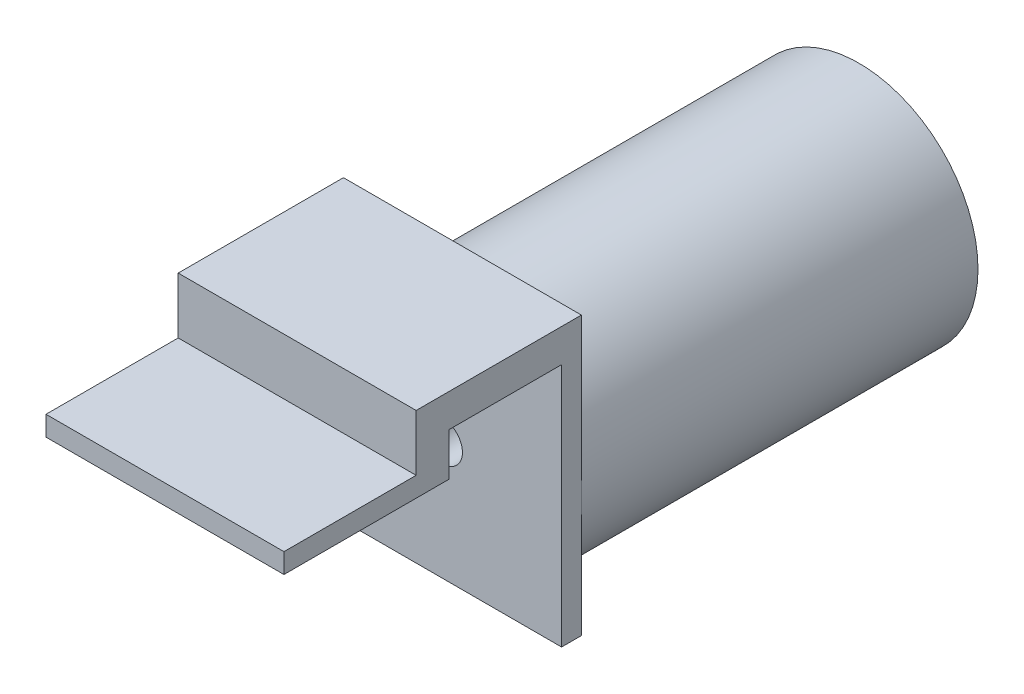
ISO-10303-21;
HEADER;
FILE_DESCRIPTION(('STEP AP214'),'2;1');
FILE_NAME('part.step','',(''),(''),'','','');
FILE_SCHEMA(('AUTOMOTIVE_DESIGN { 1 0 10303 214 1 1 1 1 }'));
ENDSEC;
DATA;
#1=APPLICATION_CONTEXT('core data for automotive mechanical design processes');
#2=APPLICATION_PROTOCOL_DEFINITION('international standard','automotive_design',2000,#1);
#3=PRODUCT_CONTEXT('',#1,'mechanical');
#4=PRODUCT('Part','Part','',(#3));
#5=PRODUCT_RELATED_PRODUCT_CATEGORY('part','',(#4));
#6=PRODUCT_DEFINITION_FORMATION('','',#4);
#7=PRODUCT_DEFINITION_CONTEXT('part definition',#1,'design');
#8=PRODUCT_DEFINITION('design','',#6,#7);
#9=PRODUCT_DEFINITION_SHAPE('','',#8);
#10=(LENGTH_UNIT() NAMED_UNIT(*) SI_UNIT(.MILLI.,.METRE.));
#11=(NAMED_UNIT(*) PLANE_ANGLE_UNIT() SI_UNIT($,.RADIAN.));
#12=(NAMED_UNIT(*) SI_UNIT($,.STERADIAN.) SOLID_ANGLE_UNIT());
#13=UNCERTAINTY_MEASURE_WITH_UNIT(LENGTH_MEASURE(1.E-05),#10,'distance_accuracy_value','');
#14=(GEOMETRIC_REPRESENTATION_CONTEXT(3) GLOBAL_UNCERTAINTY_ASSIGNED_CONTEXT((#13)) GLOBAL_UNIT_ASSIGNED_CONTEXT((#10,
#11,#12)) REPRESENTATION_CONTEXT('',''));
#15=CARTESIAN_POINT('',(0.,0.,0.));
#16=DIRECTION('',(0.,0.,1.));
#17=DIRECTION('',(1.,0.,0.));
#18=AXIS2_PLACEMENT_3D('',#15,#16,#17);
#19=CARTESIAN_POINT('',(0.,0.,85.));
#20=DIRECTION('',(0.,0.,-1.));
#21=DIRECTION('',(-1.,0.,0.));
#22=AXIS2_PLACEMENT_3D('',#19,#20,#21);
#23=PLANE('',#22);
#24=DIRECTION('',(-1.,0.,0.));
#25=VECTOR('',#24,1.);
#26=CARTESIAN_POINT('',(-18.,15.5,85.));
#27=LINE('',#26,#25);
#28=CARTESIAN_POINT('',(18.,15.5,85.));
#29=VERTEX_POINT('',#28);
#30=CARTESIAN_POINT('',(-18.,15.5,85.));
#31=VERTEX_POINT('',#30);
#32=EDGE_CURVE('E50',#29,#31,#27,.T.);
#33=ORIENTED_EDGE('',*,*,#32,.F.);
#34=DIRECTION('',(0.,1.,0.));
#35=VECTOR('',#34,1.);
#36=CARTESIAN_POINT('',(18.,19.,85.));
#37=LINE('',#36,#35);
#38=CARTESIAN_POINT('',(18.,24.,85.));
#39=VERTEX_POINT('',#38);
#40=EDGE_CURVE('E161',#29,#39,#37,.T.);
#41=ORIENTED_EDGE('',*,*,#40,.T.);
#42=DIRECTION('',(-1.,0.,0.));
#43=VECTOR('',#42,1.);
#44=CARTESIAN_POINT('',(-18.,24.,85.));
#45=LINE('',#44,#43);
#46=CARTESIAN_POINT('',(-18.,24.,85.));
#47=VERTEX_POINT('',#46);
#48=EDGE_CURVE('E133',#39,#47,#45,.T.);
#49=ORIENTED_EDGE('',*,*,#48,.T.);
#50=DIRECTION('',(0.,-1.,0.));
#51=VECTOR('',#50,1.);
#52=CARTESIAN_POINT('',(-18.,19.,85.));
#53=LINE('',#52,#51);
#54=EDGE_CURVE('E159',#47,#31,#53,.T.);
#55=ORIENTED_EDGE('',*,*,#54,.T.);
#56=EDGE_LOOP('',(#33,#41,#49,#55));
#57=FACE_BOUND('',#56,.T.);
#58=ADVANCED_FACE('F33',(#57),#23,.F.);
#59=CARTESIAN_POINT('',(0.,0.,63.));
#60=DIRECTION('',(0.,0.,1.));
#61=DIRECTION('',(1.,0.,0.));
#62=AXIS2_PLACEMENT_3D('',#59,#60,#61);
#63=PLANE('',#62);
#64=CARTESIAN_POINT('',(0.,0.,63.));
#65=DIRECTION('',(0.,0.,1.));
#66=DIRECTION('',(1.,0.,0.));
#67=AXIS2_PLACEMENT_3D('',#64,#65,#66);
#68=CIRCLE('',#67,3.);
#69=CARTESIAN_POINT('',(3.,0.,63.));
#70=VERTEX_POINT('',#69);
#71=EDGE_CURVE('E182',#70,#70,#68,.T.);
#72=ORIENTED_EDGE('',*,*,#71,.F.);
#73=EDGE_LOOP('',(#72));
#74=FACE_BOUND('',#73,.T.);
#75=DIRECTION('',(0.,1.,0.));
#76=VECTOR('',#75,1.);
#77=CARTESIAN_POINT('',(18.,24.,63.));
#78=LINE('',#77,#76);
#79=CARTESIAN_POINT('',(18.,-18.,63.));
#80=VERTEX_POINT('',#79);
#81=CARTESIAN_POINT('',(18.,19.,63.));
#82=VERTEX_POINT('',#81);
#83=EDGE_CURVE('E186',#80,#82,#78,.T.);
#84=ORIENTED_EDGE('',*,*,#83,.T.);
#85=DIRECTION('',(-1.,0.,0.));
#86=VECTOR('',#85,1.);
#87=CARTESIAN_POINT('',(18.,19.,63.));
#88=LINE('',#87,#86);
#89=CARTESIAN_POINT('',(-18.,19.,63.));
#90=VERTEX_POINT('',#89);
#91=EDGE_CURVE('E170',#82,#90,#88,.T.);
#92=ORIENTED_EDGE('',*,*,#91,.T.);
#93=DIRECTION('',(0.,-1.,0.));
#94=VECTOR('',#93,1.);
#95=CARTESIAN_POINT('',(-18.,24.,63.));
#96=LINE('',#95,#94);
#97=CARTESIAN_POINT('',(-18.,-18.,63.));
#98=VERTEX_POINT('',#97);
#99=EDGE_CURVE('E189',#90,#98,#96,.T.);
#100=ORIENTED_EDGE('',*,*,#99,.T.);
#101=DIRECTION('',(1.,0.,0.));
#102=VECTOR('',#101,1.);
#103=CARTESIAN_POINT('',(-18.,-18.,63.));
#104=LINE('',#103,#102);
#105=EDGE_CURVE('E192',#98,#80,#104,.T.);
#106=ORIENTED_EDGE('',*,*,#105,.T.);
#107=EDGE_LOOP('',(#84,#92,#100,#106));
#108=FACE_BOUND('',#107,.T.);
#109=ADVANCED_FACE('F249',(#74,#108),#63,.T.);
#110=CARTESIAN_POINT('',(0.,0.,60.));
#111=DIRECTION('',(0.,0.,-1.));
#112=DIRECTION('',(-1.,0.,0.));
#113=AXIS2_PLACEMENT_3D('',#110,#111,#112);
#114=CYLINDRICAL_SURFACE('',#113,18.);
#115=CARTESIAN_POINT('',(0.,0.,60.));
#116=DIRECTION('',(0.,0.,1.));
#117=DIRECTION('',(1.,0.,0.));
#118=AXIS2_PLACEMENT_3D('',#115,#116,#117);
#119=CIRCLE('',#118,18.);
#120=CARTESIAN_POINT('',(18.,0.,60.));
#121=VERTEX_POINT('',#120);
#122=CARTESIAN_POINT('',(-18.,0.,60.));
#123=VERTEX_POINT('',#122);
#124=EDGE_CURVE('E11',#121,#123,#119,.T.);
#125=ORIENTED_EDGE('',*,*,#124,.F.);
#126=CARTESIAN_POINT('',(0.,-18.,60.));
#127=VERTEX_POINT('',#126);
#128=EDGE_CURVE('E43',#127,#121,#119,.T.);
#129=ORIENTED_EDGE('',*,*,#128,.F.);
#130=EDGE_CURVE('E42',#123,#127,#119,.T.);
#131=ORIENTED_EDGE('',*,*,#130,.F.);
#132=EDGE_LOOP('',(#125,#129,#131));
#133=FACE_BOUND('',#132,.T.);
#134=CARTESIAN_POINT('',(0.,0.,0.));
#135=DIRECTION('',(0.,0.,1.));
#136=DIRECTION('',(1.,0.,0.));
#137=AXIS2_PLACEMENT_3D('',#134,#135,#136);
#138=CIRCLE('',#137,18.);
#139=CARTESIAN_POINT('',(18.,0.,0.));
#140=VERTEX_POINT('',#139);
#141=EDGE_CURVE('E37',#140,#140,#138,.T.);
#142=ORIENTED_EDGE('',*,*,#141,.T.);
#143=EDGE_LOOP('',(#142));
#144=FACE_BOUND('',#143,.T.);
#145=ADVANCED_FACE('F35',(#133,#144),#114,.T.);
#146=CARTESIAN_POINT('',(0.,0.,0.));
#147=DIRECTION('',(0.,0.,1.));
#148=DIRECTION('',(1.,0.,0.));
#149=AXIS2_PLACEMENT_3D('',#146,#147,#148);
#150=PLANE('',#149);
#151=CARTESIAN_POINT('',(0.,0.,0.));
#152=DIRECTION('',(0.,0.,1.));
#153=DIRECTION('',(1.,0.,0.));
#154=AXIS2_PLACEMENT_3D('',#151,#152,#153);
#155=CIRCLE('',#154,3.);
#156=CARTESIAN_POINT('',(3.,0.,0.));
#157=VERTEX_POINT('',#156);
#158=EDGE_CURVE('E179',#157,#157,#155,.T.);
#159=ORIENTED_EDGE('',*,*,#158,.T.);
#160=EDGE_LOOP('',(#159));
#161=FACE_BOUND('',#160,.T.);
#162=ORIENTED_EDGE('',*,*,#141,.F.);
#163=EDGE_LOOP('',(#162));
#164=FACE_BOUND('',#163,.T.);
#165=ADVANCED_FACE('F248',(#161,#164),#150,.F.);
#166=CARTESIAN_POINT('',(0.,0.,60.));
#167=DIRECTION('',(0.,0.,1.));
#168=DIRECTION('',(1.,0.,0.));
#169=AXIS2_PLACEMENT_3D('',#166,#167,#168);
#170=PLANE('',#169);
#171=DIRECTION('',(0.,1.,0.));
#172=VECTOR('',#171,1.);
#173=CARTESIAN_POINT('',(18.,24.,60.));
#174=LINE('',#173,#172);
#175=CARTESIAN_POINT('',(18.,24.,60.));
#176=VERTEX_POINT('',#175);
#177=EDGE_CURVE('E185',#121,#176,#174,.T.);
#178=ORIENTED_EDGE('',*,*,#177,.F.);
#179=ORIENTED_EDGE('',*,*,#124,.T.);
#180=DIRECTION('',(0.,-1.,0.));
#181=VECTOR('',#180,1.);
#182=CARTESIAN_POINT('',(-18.,24.,60.));
#183=LINE('',#182,#181);
#184=CARTESIAN_POINT('',(-18.,24.,60.));
#185=VERTEX_POINT('',#184);
#186=EDGE_CURVE('E200',#185,#123,#183,.T.);
#187=ORIENTED_EDGE('',*,*,#186,.F.);
#188=DIRECTION('',(-1.,0.,0.));
#189=VECTOR('',#188,1.);
#190=CARTESIAN_POINT('',(-18.,24.,60.));
#191=LINE('',#190,#189);
#192=EDGE_CURVE('E197',#176,#185,#191,.T.);
#193=ORIENTED_EDGE('',*,*,#192,.F.);
#194=EDGE_LOOP('',(#178,#179,#187,#193));
#195=FACE_BOUND('',#194,.T.);
#196=ADVANCED_FACE('F246',(#195),#170,.F.);
#197=CARTESIAN_POINT('',(-18.,-18.,60.));
#198=VERTEX_POINT('',#197);
#199=EDGE_CURVE('E199',#123,#198,#183,.T.);
#200=ORIENTED_EDGE('',*,*,#199,.F.);
#201=ORIENTED_EDGE('',*,*,#130,.T.);
#202=DIRECTION('',(1.,0.,0.));
#203=VECTOR('',#202,1.);
#204=CARTESIAN_POINT('',(-18.,-18.,60.));
#205=LINE('',#204,#203);
#206=EDGE_CURVE('E190',#198,#127,#205,.T.);
#207=ORIENTED_EDGE('',*,*,#206,.F.);
#208=EDGE_LOOP('',(#200,#201,#207));
#209=FACE_BOUND('',#208,.T.);
#210=ADVANCED_FACE('F231',(#209),#170,.F.);
#211=CARTESIAN_POINT('',(18.,-18.,60.));
#212=VERTEX_POINT('',#211);
#213=EDGE_CURVE('E203',#127,#212,#205,.T.);
#214=ORIENTED_EDGE('',*,*,#213,.F.);
#215=ORIENTED_EDGE('',*,*,#128,.T.);
#216=EDGE_CURVE('E195',#212,#121,#174,.T.);
#217=ORIENTED_EDGE('',*,*,#216,.F.);
#218=EDGE_LOOP('',(#214,#215,#217));
#219=FACE_BOUND('',#218,.T.);
#220=ADVANCED_FACE('F233',(#219),#170,.F.);
#221=CARTESIAN_POINT('',(18.,24.,63.));
#222=DIRECTION('',(-1.,0.,0.));
#223=DIRECTION('',(0.,-1.,0.));
#224=AXIS2_PLACEMENT_3D('',#221,#222,#223);
#225=PLANE('',#224);
#226=ORIENTED_EDGE('',*,*,#216,.T.);
#227=ORIENTED_EDGE('',*,*,#177,.T.);
#228=DIRECTION('',(0.,0.,-1.));
#229=VECTOR('',#228,1.);
#230=CARTESIAN_POINT('',(18.,24.,63.));
#231=LINE('',#230,#229);
#232=EDGE_CURVE('E214',#39,#176,#231,.T.);
#233=ORIENTED_EDGE('',*,*,#232,.F.);
#234=ORIENTED_EDGE('',*,*,#40,.F.);
#235=DIRECTION('',(0.,0.,-1.));
#236=VECTOR('',#235,1.);
#237=CARTESIAN_POINT('',(18.,15.5,105.));
#238=LINE('',#237,#236);
#239=CARTESIAN_POINT('',(18.,15.5,105.));
#240=VERTEX_POINT('',#239);
#241=EDGE_CURVE('E140',#240,#29,#238,.T.);
#242=ORIENTED_EDGE('',*,*,#241,.F.);
#243=DIRECTION('',(0.,1.,0.));
#244=VECTOR('',#243,1.);
#245=CARTESIAN_POINT('',(18.,15.5,105.));
#246=LINE('',#245,#244);
#247=CARTESIAN_POINT('',(18.,12.5,105.));
#248=VERTEX_POINT('',#247);
#249=EDGE_CURVE('E136',#248,#240,#246,.T.);
#250=ORIENTED_EDGE('',*,*,#249,.F.);
#251=DIRECTION('',(0.,0.,-1.));
#252=VECTOR('',#251,1.);
#253=CARTESIAN_POINT('',(18.,12.5,85.));
#254=LINE('',#253,#252);
#255=CARTESIAN_POINT('',(18.,12.5,80.));
#256=VERTEX_POINT('',#255);
#257=EDGE_CURVE('E122',#248,#256,#254,.T.);
#258=ORIENTED_EDGE('',*,*,#257,.T.);
#259=DIRECTION('',(0.,1.,0.));
#260=VECTOR('',#259,1.);
#261=CARTESIAN_POINT('',(18.,24.,80.));
#262=LINE('',#261,#260);
#263=CARTESIAN_POINT('',(18.,19.,80.));
#264=VERTEX_POINT('',#263);
#265=EDGE_CURVE('E162',#256,#264,#262,.T.);
#266=ORIENTED_EDGE('',*,*,#265,.T.);
#267=DIRECTION('',(0.,0.,-1.));
#268=VECTOR('',#267,1.);
#269=CARTESIAN_POINT('',(18.,19.,80.));
#270=LINE('',#269,#268);
#271=EDGE_CURVE('E176',#264,#82,#270,.T.);
#272=ORIENTED_EDGE('',*,*,#271,.T.);
#273=ORIENTED_EDGE('',*,*,#83,.F.);
#274=DIRECTION('',(0.,0.,-1.));
#275=VECTOR('',#274,1.);
#276=CARTESIAN_POINT('',(18.,-18.,63.));
#277=LINE('',#276,#275);
#278=EDGE_CURVE('E194',#80,#212,#277,.T.);
#279=ORIENTED_EDGE('',*,*,#278,.T.);
#280=EDGE_LOOP('',(#226,#227,#233,#234,#242,#250,#258,#266,#272,#273,#279));
#281=FACE_BOUND('',#280,.T.);
#282=ADVANCED_FACE('F138',(#281),#225,.F.);
#283=CARTESIAN_POINT('',(-18.,24.,63.));
#284=DIRECTION('',(0.,-1.,0.));
#285=DIRECTION('',(1.,0.,0.));
#286=AXIS2_PLACEMENT_3D('',#283,#284,#285);
#287=PLANE('',#286);
#288=ORIENTED_EDGE('',*,*,#192,.T.);
#289=DIRECTION('',(0.,0.,-1.));
#290=VECTOR('',#289,1.);
#291=CARTESIAN_POINT('',(-18.,24.,63.));
#292=LINE('',#291,#290);
#293=EDGE_CURVE('E211',#47,#185,#292,.T.);
#294=ORIENTED_EDGE('',*,*,#293,.F.);
#295=ORIENTED_EDGE('',*,*,#48,.F.);
#296=ORIENTED_EDGE('',*,*,#232,.T.);
#297=EDGE_LOOP('',(#288,#294,#295,#296));
#298=FACE_BOUND('',#297,.T.);
#299=ADVANCED_FACE('F284',(#298),#287,.F.);
#300=CARTESIAN_POINT('',(-18.,24.,63.));
#301=DIRECTION('',(1.,0.,0.));
#302=DIRECTION('',(0.,1.,0.));
#303=AXIS2_PLACEMENT_3D('',#300,#301,#302);
#304=PLANE('',#303);
#305=ORIENTED_EDGE('',*,*,#186,.T.);
#306=ORIENTED_EDGE('',*,*,#199,.T.);
#307=DIRECTION('',(0.,0.,-1.));
#308=VECTOR('',#307,1.);
#309=CARTESIAN_POINT('',(-18.,-18.,63.));
#310=LINE('',#309,#308);
#311=EDGE_CURVE('E208',#98,#198,#310,.T.);
#312=ORIENTED_EDGE('',*,*,#311,.F.);
#313=ORIENTED_EDGE('',*,*,#99,.F.);
#314=DIRECTION('',(0.,0.,1.));
#315=VECTOR('',#314,1.);
#316=CARTESIAN_POINT('',(-18.,19.,63.));
#317=LINE('',#316,#315);
#318=CARTESIAN_POINT('',(-18.,19.,80.));
#319=VERTEX_POINT('',#318);
#320=EDGE_CURVE('E58',#90,#319,#317,.T.);
#321=ORIENTED_EDGE('',*,*,#320,.T.);
#322=DIRECTION('',(0.,-1.,0.));
#323=VECTOR('',#322,1.);
#324=CARTESIAN_POINT('',(-18.,12.5,80.));
#325=LINE('',#324,#323);
#326=CARTESIAN_POINT('',(-18.,12.5,80.));
#327=VERTEX_POINT('',#326);
#328=EDGE_CURVE('E158',#319,#327,#325,.T.);
#329=ORIENTED_EDGE('',*,*,#328,.T.);
#330=DIRECTION('',(0.,0.,-1.));
#331=VECTOR('',#330,1.);
#332=CARTESIAN_POINT('',(-18.,12.5,85.));
#333=LINE('',#332,#331);
#334=CARTESIAN_POINT('',(-18.,12.5,105.));
#335=VERTEX_POINT('',#334);
#336=EDGE_CURVE('E132',#335,#327,#333,.T.);
#337=ORIENTED_EDGE('',*,*,#336,.F.);
#338=DIRECTION('',(0.,-1.,0.));
#339=VECTOR('',#338,1.);
#340=CARTESIAN_POINT('',(-18.,12.5,105.));
#341=LINE('',#340,#339);
#342=CARTESIAN_POINT('',(-18.,15.5,105.));
#343=VERTEX_POINT('',#342);
#344=EDGE_CURVE('E148',#343,#335,#341,.T.);
#345=ORIENTED_EDGE('',*,*,#344,.F.);
#346=DIRECTION('',(0.,0.,-1.));
#347=VECTOR('',#346,1.);
#348=CARTESIAN_POINT('',(-18.,15.5,105.));
#349=LINE('',#348,#347);
#350=EDGE_CURVE('E153',#343,#31,#349,.T.);
#351=ORIENTED_EDGE('',*,*,#350,.T.);
#352=ORIENTED_EDGE('',*,*,#54,.F.);
#353=ORIENTED_EDGE('',*,*,#293,.T.);
#354=EDGE_LOOP('',(#305,#306,#312,#313,#321,#329,#337,#345,#351,#352,#353));
#355=FACE_BOUND('',#354,.T.);
#356=ADVANCED_FACE('F241',(#355),#304,.F.);
#357=CARTESIAN_POINT('',(-18.,-18.,63.));
#358=DIRECTION('',(0.,1.,0.));
#359=DIRECTION('',(0.,0.,1.));
#360=AXIS2_PLACEMENT_3D('',#357,#358,#359);
#361=PLANE('',#360);
#362=ORIENTED_EDGE('',*,*,#206,.T.);
#363=ORIENTED_EDGE('',*,*,#213,.T.);
#364=ORIENTED_EDGE('',*,*,#278,.F.);
#365=ORIENTED_EDGE('',*,*,#105,.F.);
#366=ORIENTED_EDGE('',*,*,#311,.T.);
#367=EDGE_LOOP('',(#362,#363,#364,#365,#366));
#368=FACE_BOUND('',#367,.T.);
#369=ADVANCED_FACE('F236',(#368),#361,.F.);
#370=CARTESIAN_POINT('',(0.,0.,63.));
#371=DIRECTION('',(0.,0.,-1.));
#372=DIRECTION('',(-1.,0.,0.));
#373=AXIS2_PLACEMENT_3D('',#370,#371,#372);
#374=CYLINDRICAL_SURFACE('',#373,3.);
#375=ORIENTED_EDGE('',*,*,#71,.T.);
#376=EDGE_LOOP('',(#375));
#377=FACE_BOUND('',#376,.T.);
#378=ORIENTED_EDGE('',*,*,#158,.F.);
#379=EDGE_LOOP('',(#378));
#380=FACE_BOUND('',#379,.T.);
#381=ADVANCED_FACE('F274',(#377,#380),#374,.F.);
#382=CARTESIAN_POINT('',(0.,19.,0.));
#383=DIRECTION('',(0.,1.,0.));
#384=DIRECTION('',(-1.,0.,0.));
#385=AXIS2_PLACEMENT_3D('',#382,#383,#384);
#386=PLANE('',#385);
#387=ORIENTED_EDGE('',*,*,#91,.F.);
#388=ORIENTED_EDGE('',*,*,#271,.F.);
#389=DIRECTION('',(1.,0.,0.));
#390=VECTOR('',#389,1.);
#391=CARTESIAN_POINT('',(-18.,19.,80.));
#392=LINE('',#391,#390);
#393=EDGE_CURVE('E173',#319,#264,#392,.T.);
#394=ORIENTED_EDGE('',*,*,#393,.F.);
#395=ORIENTED_EDGE('',*,*,#320,.F.);
#396=EDGE_LOOP('',(#387,#388,#394,#395));
#397=FACE_BOUND('',#396,.T.);
#398=ADVANCED_FACE('F271',(#397),#386,.F.);
#399=CARTESIAN_POINT('',(18.,12.5,85.));
#400=DIRECTION('',(0.,1.,0.));
#401=DIRECTION('',(-1.,0.,0.));
#402=AXIS2_PLACEMENT_3D('',#399,#400,#401);
#403=PLANE('',#402);
#404=DIRECTION('',(1.,0.,0.));
#405=VECTOR('',#404,1.);
#406=CARTESIAN_POINT('',(18.,12.5,80.));
#407=LINE('',#406,#405);
#408=EDGE_CURVE('E129',#327,#256,#407,.T.);
#409=ORIENTED_EDGE('',*,*,#408,.T.);
#410=ORIENTED_EDGE('',*,*,#257,.F.);
#411=DIRECTION('',(1.,0.,0.));
#412=VECTOR('',#411,1.);
#413=CARTESIAN_POINT('',(18.,12.5,105.));
#414=LINE('',#413,#412);
#415=EDGE_CURVE('E127',#335,#248,#414,.T.);
#416=ORIENTED_EDGE('',*,*,#415,.F.);
#417=ORIENTED_EDGE('',*,*,#336,.T.);
#418=EDGE_LOOP('',(#409,#410,#416,#417));
#419=FACE_BOUND('',#418,.T.);
#420=ADVANCED_FACE('F124',(#419),#403,.F.);
#421=CARTESIAN_POINT('',(0.,0.,80.));
#422=DIRECTION('',(0.,0.,-1.));
#423=DIRECTION('',(-1.,0.,0.));
#424=AXIS2_PLACEMENT_3D('',#421,#422,#423);
#425=PLANE('',#424);
#426=ORIENTED_EDGE('',*,*,#328,.F.);
#427=ORIENTED_EDGE('',*,*,#393,.T.);
#428=ORIENTED_EDGE('',*,*,#265,.F.);
#429=ORIENTED_EDGE('',*,*,#408,.F.);
#430=EDGE_LOOP('',(#426,#427,#428,#429));
#431=FACE_BOUND('',#430,.T.);
#432=ADVANCED_FACE('F265',(#431),#425,.T.);
#433=CARTESIAN_POINT('',(-18.,15.5,105.));
#434=DIRECTION('',(0.,-1.,0.));
#435=DIRECTION('',(0.,0.,-1.));
#436=AXIS2_PLACEMENT_3D('',#433,#434,#435);
#437=PLANE('',#436);
#438=ORIENTED_EDGE('',*,*,#32,.T.);
#439=ORIENTED_EDGE('',*,*,#350,.F.);
#440=DIRECTION('',(-1.,0.,0.));
#441=VECTOR('',#440,1.);
#442=CARTESIAN_POINT('',(-18.,15.5,105.));
#443=LINE('',#442,#441);
#444=EDGE_CURVE('E143',#240,#343,#443,.T.);
#445=ORIENTED_EDGE('',*,*,#444,.F.);
#446=ORIENTED_EDGE('',*,*,#241,.T.);
#447=EDGE_LOOP('',(#438,#439,#445,#446));
#448=FACE_BOUND('',#447,.T.);
#449=ADVANCED_FACE('F263',(#448),#437,.F.);
#450=CARTESIAN_POINT('',(0.,0.,105.));
#451=DIRECTION('',(0.,0.,-1.));
#452=DIRECTION('',(-1.,0.,0.));
#453=AXIS2_PLACEMENT_3D('',#450,#451,#452);
#454=PLANE('',#453);
#455=ORIENTED_EDGE('',*,*,#415,.T.);
#456=ORIENTED_EDGE('',*,*,#249,.T.);
#457=ORIENTED_EDGE('',*,*,#444,.T.);
#458=ORIENTED_EDGE('',*,*,#344,.T.);
#459=EDGE_LOOP('',(#455,#456,#457,#458));
#460=FACE_BOUND('',#459,.T.);
#461=ADVANCED_FACE('F146',(#460),#454,.F.);
#462=CLOSED_SHELL('',(#58,#109,#145,#165,#196,#210,#220,#282,#299,#356,#369,#381,#398,#420,#432,
#449,#461));
#463=MANIFOLD_SOLID_BREP('B2',#462);
#464=ADVANCED_BREP_SHAPE_REPRESENTATION('',(#18,#463),#14);
#465=SHAPE_DEFINITION_REPRESENTATION(#9,#464);
ENDSEC;
END-ISO-10303-21;
